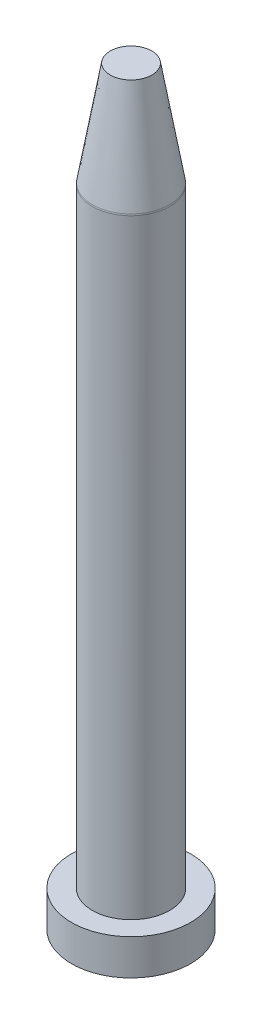
ISO-10303-21;
HEADER;
FILE_DESCRIPTION(('STEP AP214'),'2;1');
FILE_NAME('part.step','',(''),(''),'','','');
FILE_SCHEMA(('AUTOMOTIVE_DESIGN { 1 0 10303 214 1 1 1 1 }'));
ENDSEC;
DATA;
#1=APPLICATION_CONTEXT('core data for automotive mechanical design processes');
#2=APPLICATION_PROTOCOL_DEFINITION('international standard','automotive_design',2000,#1);
#3=PRODUCT_CONTEXT('',#1,'mechanical');
#4=PRODUCT('Part','Part','',(#3));
#5=PRODUCT_RELATED_PRODUCT_CATEGORY('part','',(#4));
#6=PRODUCT_DEFINITION_FORMATION('','',#4);
#7=PRODUCT_DEFINITION_CONTEXT('part definition',#1,'design');
#8=PRODUCT_DEFINITION('design','',#6,#7);
#9=PRODUCT_DEFINITION_SHAPE('','',#8);
#10=(LENGTH_UNIT() NAMED_UNIT(*) SI_UNIT(.MILLI.,.METRE.));
#11=(NAMED_UNIT(*) PLANE_ANGLE_UNIT() SI_UNIT($,.RADIAN.));
#12=(NAMED_UNIT(*) SI_UNIT($,.STERADIAN.) SOLID_ANGLE_UNIT());
#13=UNCERTAINTY_MEASURE_WITH_UNIT(LENGTH_MEASURE(1.E-05),#10,'distance_accuracy_value','');
#14=(GEOMETRIC_REPRESENTATION_CONTEXT(3) GLOBAL_UNCERTAINTY_ASSIGNED_CONTEXT((#13)) GLOBAL_UNIT_ASSIGNED_CONTEXT((#10,
#11,#12)) REPRESENTATION_CONTEXT('',''));
#15=CARTESIAN_POINT('',(0.,0.,0.));
#16=DIRECTION('',(0.,0.,1.));
#17=DIRECTION('',(1.,0.,0.));
#18=AXIS2_PLACEMENT_3D('',#15,#16,#17);
#19=CARTESIAN_POINT('',(0.,252.,0.));
#20=DIRECTION('',(0.,1.,0.));
#21=DIRECTION('',(0.,0.,1.));
#22=AXIS2_PLACEMENT_3D('',#19,#20,#21);
#23=PLANE('',#22);
#24=CARTESIAN_POINT('',(0.,252.,0.));
#25=DIRECTION('',(0.,-1.,0.));
#26=DIRECTION('',(0.,0.,-1.));
#27=AXIS2_PLACEMENT_3D('',#24,#25,#26);
#28=CIRCLE('',#27,7.);
#29=CARTESIAN_POINT('',(0.,252.,-7.));
#30=VERTEX_POINT('',#29);
#31=EDGE_CURVE('E42',#30,#30,#28,.T.);
#32=ORIENTED_EDGE('',*,*,#31,.F.);
#33=EDGE_LOOP('',(#32));
#34=FACE_BOUND('',#33,.T.);
#35=ADVANCED_FACE('F31',(#34),#23,.T.);
#36=CARTESIAN_POINT('',(0.,217.,0.));
#37=DIRECTION('',(0.,-1.,0.));
#38=DIRECTION('',(0.,0.,-1.));
#39=AXIS2_PLACEMENT_3D('',#36,#37,#38);
#40=CONICAL_SURFACE('',#39,13.,0.169778273968338);
#41=CARTESIAN_POINT('',(0.,217.251610540768,0.));
#42=DIRECTION('',(0.,1.,0.));
#43=DIRECTION('',(0.,0.,1.));
#44=AXIS2_PLACEMENT_3D('',#41,#42,#43);
#45=CIRCLE('',#44,12.9568667644398);
#46=CARTESIAN_POINT('',(0.,217.251610540768,12.9568667644398));
#47=VERTEX_POINT('',#46);
#48=EDGE_CURVE('E10',#47,#47,#45,.T.);
#49=ORIENTED_EDGE('',*,*,#48,.T.);
#50=EDGE_LOOP('',(#49));
#51=FACE_BOUND('',#50,.T.);
#52=ORIENTED_EDGE('',*,*,#31,.T.);
#53=EDGE_LOOP('',(#52));
#54=FACE_BOUND('',#53,.T.);
#55=ADVANCED_FACE('F74',(#51,#54),#40,.T.);
#56=CARTESIAN_POINT('',(0.,0.,0.));
#57=DIRECTION('',(0.,-1.,0.));
#58=DIRECTION('',(0.,0.,-1.));
#59=AXIS2_PLACEMENT_3D('',#56,#57,#58);
#60=CYLINDRICAL_SURFACE('',#59,13.);
#61=CARTESIAN_POINT('',(0.,216.744719095435,0.));
#62=DIRECTION('',(0.,1.,0.));
#63=DIRECTION('',(0.,0.,1.));
#64=AXIS2_PLACEMENT_3D('',#61,#62,#63);
#65=CIRCLE('',#64,13.);
#66=CARTESIAN_POINT('',(0.,216.744719095435,13.));
#67=VERTEX_POINT('',#66);
#68=EDGE_CURVE('E38',#67,#67,#65,.F.);
#69=ORIENTED_EDGE('',*,*,#68,.T.);
#70=EDGE_LOOP('',(#69));
#71=FACE_BOUND('',#70,.T.);
#72=CARTESIAN_POINT('',(0.,12.,0.));
#73=DIRECTION('',(0.,-1.,0.));
#74=DIRECTION('',(0.,0.,-1.));
#75=AXIS2_PLACEMENT_3D('',#72,#73,#74);
#76=CIRCLE('',#75,13.);
#77=CARTESIAN_POINT('',(0.,12.,-13.));
#78=VERTEX_POINT('',#77);
#79=EDGE_CURVE('E46',#78,#78,#76,.T.);
#80=ORIENTED_EDGE('',*,*,#79,.F.);
#81=EDGE_LOOP('',(#80));
#82=FACE_BOUND('',#81,.T.);
#83=ADVANCED_FACE('F70',(#71,#82),#60,.T.);
#84=CARTESIAN_POINT('',(20.,12.,0.));
#85=DIRECTION('',(0.,1.,0.));
#86=DIRECTION('',(0.,0.,1.));
#87=AXIS2_PLACEMENT_3D('',#84,#85,#86);
#88=PLANE('',#87);
#89=ORIENTED_EDGE('',*,*,#79,.T.);
#90=EDGE_LOOP('',(#89));
#91=FACE_BOUND('',#90,.T.);
#92=CARTESIAN_POINT('',(0.,12.,0.));
#93=DIRECTION('',(0.,-1.,0.));
#94=DIRECTION('',(0.,0.,-1.));
#95=AXIS2_PLACEMENT_3D('',#92,#93,#94);
#96=CIRCLE('',#95,20.);
#97=CARTESIAN_POINT('',(0.,12.,-20.));
#98=VERTEX_POINT('',#97);
#99=EDGE_CURVE('E51',#98,#98,#96,.T.);
#100=ORIENTED_EDGE('',*,*,#99,.F.);
#101=EDGE_LOOP('',(#100));
#102=FACE_BOUND('',#101,.T.);
#103=ADVANCED_FACE('F62',(#91,#102),#88,.T.);
#104=CARTESIAN_POINT('',(0.,0.,0.));
#105=DIRECTION('',(0.,-1.,0.));
#106=DIRECTION('',(0.,0.,-1.));
#107=AXIS2_PLACEMENT_3D('',#104,#105,#106);
#108=CYLINDRICAL_SURFACE('',#107,20.);
#109=ORIENTED_EDGE('',*,*,#99,.T.);
#110=EDGE_LOOP('',(#109));
#111=FACE_BOUND('',#110,.T.);
#112=CARTESIAN_POINT('',(0.,0.,0.));
#113=DIRECTION('',(0.,-1.,0.));
#114=DIRECTION('',(0.,0.,-1.));
#115=AXIS2_PLACEMENT_3D('',#112,#113,#114);
#116=CIRCLE('',#115,20.);
#117=CARTESIAN_POINT('',(0.,0.,-20.));
#118=VERTEX_POINT('',#117);
#119=EDGE_CURVE('E54',#118,#118,#116,.T.);
#120=ORIENTED_EDGE('',*,*,#119,.F.);
#121=EDGE_LOOP('',(#120));
#122=FACE_BOUND('',#121,.T.);
#123=ADVANCED_FACE('F60',(#111,#122),#108,.T.);
#124=CARTESIAN_POINT('',(0.,0.,0.));
#125=DIRECTION('',(0.,-1.,0.));
#126=DIRECTION('',(0.,0.,-1.));
#127=AXIS2_PLACEMENT_3D('',#124,#125,#126);
#128=PLANE('',#127);
#129=ORIENTED_EDGE('',*,*,#119,.T.);
#130=EDGE_LOOP('',(#129));
#131=FACE_BOUND('',#130,.T.);
#132=ADVANCED_FACE('F58',(#131),#128,.T.);
#133=CARTESIAN_POINT('',(0.,216.744719095435,0.));
#134=DIRECTION('',(0.,1.,0.));
#135=DIRECTION('',(0.,0.,1.));
#136=AXIS2_PLACEMENT_3D('',#133,#134,#135);
#137=TOROIDAL_SURFACE('',#136,10.,3.);
#138=ORIENTED_EDGE('',*,*,#48,.F.);
#139=EDGE_LOOP('',(#138));
#140=FACE_BOUND('',#139,.T.);
#141=ORIENTED_EDGE('',*,*,#68,.F.);
#142=EDGE_LOOP('',(#141));
#143=FACE_BOUND('',#142,.T.);
#144=ADVANCED_FACE('F33',(#140,#143),#137,.T.);
#145=CLOSED_SHELL('',(#35,#55,#83,#103,#123,#132,#144));
#146=MANIFOLD_SOLID_BREP('B2',#145);
#147=ADVANCED_BREP_SHAPE_REPRESENTATION('',(#18,#146),#14);
#148=SHAPE_DEFINITION_REPRESENTATION(#9,#147);
ENDSEC;
END-ISO-10303-21;
